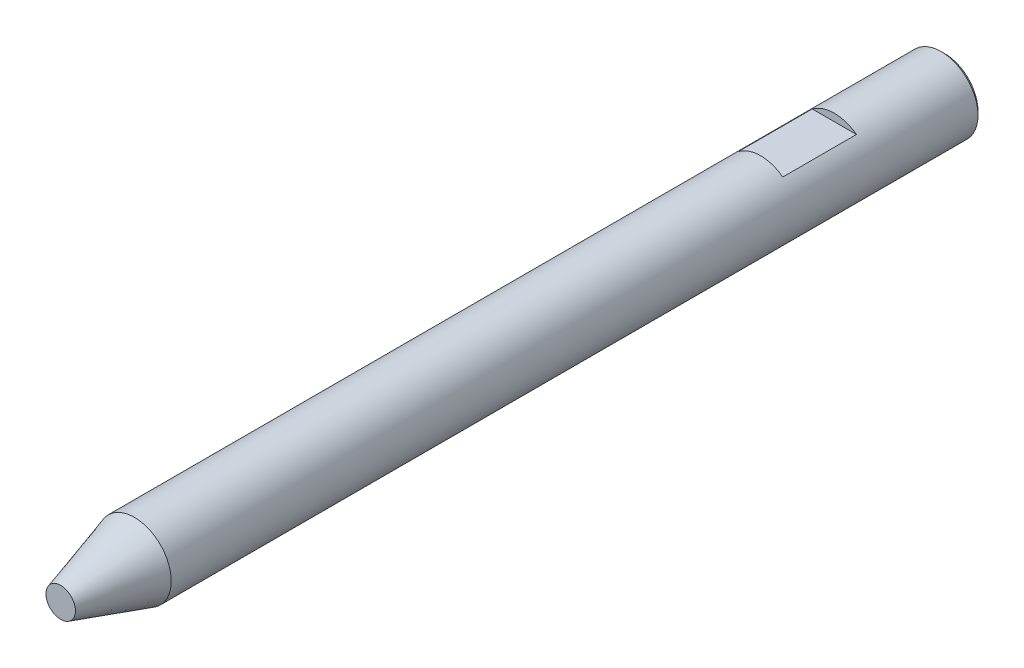
ISO-10303-21;
HEADER;
FILE_DESCRIPTION(('STEP AP214'),'2;1');
FILE_NAME('part.step','',(''),(''),'','','');
FILE_SCHEMA(('AUTOMOTIVE_DESIGN { 1 0 10303 214 1 1 1 1 }'));
ENDSEC;
DATA;
#1=APPLICATION_CONTEXT('core data for automotive mechanical design processes');
#2=APPLICATION_PROTOCOL_DEFINITION('international standard','automotive_design',2000,#1);
#3=PRODUCT_CONTEXT('',#1,'mechanical');
#4=PRODUCT('Part','Part','',(#3));
#5=PRODUCT_RELATED_PRODUCT_CATEGORY('part','',(#4));
#6=PRODUCT_DEFINITION_FORMATION('','',#4);
#7=PRODUCT_DEFINITION_CONTEXT('part definition',#1,'design');
#8=PRODUCT_DEFINITION('design','',#6,#7);
#9=PRODUCT_DEFINITION_SHAPE('','',#8);
#10=(LENGTH_UNIT() NAMED_UNIT(*) SI_UNIT(.MILLI.,.METRE.));
#11=(NAMED_UNIT(*) PLANE_ANGLE_UNIT() SI_UNIT($,.RADIAN.));
#12=(NAMED_UNIT(*) SI_UNIT($,.STERADIAN.) SOLID_ANGLE_UNIT());
#13=UNCERTAINTY_MEASURE_WITH_UNIT(LENGTH_MEASURE(1.E-05),#10,'distance_accuracy_value','');
#14=(GEOMETRIC_REPRESENTATION_CONTEXT(3) GLOBAL_UNCERTAINTY_ASSIGNED_CONTEXT((#13)) GLOBAL_UNIT_ASSIGNED_CONTEXT((#10,
#11,#12)) REPRESENTATION_CONTEXT('',''));
#15=CARTESIAN_POINT('',(0.,0.,0.));
#16=DIRECTION('',(0.,0.,1.));
#17=DIRECTION('',(1.,0.,0.));
#18=AXIS2_PLACEMENT_3D('',#15,#16,#17);
#19=CARTESIAN_POINT('',(0.,0.,120.));
#20=DIRECTION('',(0.,0.,-1.));
#21=DIRECTION('',(-1.,0.,0.));
#22=AXIS2_PLACEMENT_3D('',#19,#20,#21);
#23=CYLINDRICAL_SURFACE('',#22,5.);
#24=CARTESIAN_POINT('',(0.,0.,0.499999999999987));
#25=DIRECTION('',(0.,0.,1.));
#26=DIRECTION('',(1.,0.,0.));
#27=AXIS2_PLACEMENT_3D('',#24,#25,#26);
#28=CIRCLE('',#27,5.);
#29=CARTESIAN_POINT('',(5.,0.,0.499999999999987));
#30=VERTEX_POINT('',#29);
#31=EDGE_CURVE('E25',#30,#30,#28,.T.);
#32=ORIENTED_EDGE('',*,*,#31,.T.);
#33=EDGE_LOOP('',(#32));
#34=FACE_BOUND('',#33,.T.);
#35=CARTESIAN_POINT('',(0.,0.,25.));
#36=DIRECTION('',(0.,0.,-1.));
#37=DIRECTION('',(-1.,0.,0.));
#38=AXIS2_PLACEMENT_3D('',#35,#36,#37);
#39=CIRCLE('',#38,5.);
#40=CARTESIAN_POINT('',(-3.,4.,25.));
#41=VERTEX_POINT('',#40);
#42=CARTESIAN_POINT('',(3.,4.,25.));
#43=VERTEX_POINT('',#42);
#44=EDGE_CURVE('E65',#41,#43,#39,.T.);
#45=ORIENTED_EDGE('',*,*,#44,.F.);
#46=DIRECTION('',(0.,0.,-1.));
#47=VECTOR('',#46,1.);
#48=CARTESIAN_POINT('',(-3.,4.,120.));
#49=LINE('',#48,#47);
#50=CARTESIAN_POINT('',(-3.,4.,15.));
#51=VERTEX_POINT('',#50);
#52=EDGE_CURVE('E140',#41,#51,#49,.T.);
#53=ORIENTED_EDGE('',*,*,#52,.T.);
#54=CARTESIAN_POINT('',(0.,0.,15.));
#55=DIRECTION('',(0.,0.,-1.));
#56=DIRECTION('',(-1.,0.,0.));
#57=AXIS2_PLACEMENT_3D('',#54,#55,#56);
#58=CIRCLE('',#57,5.);
#59=CARTESIAN_POINT('',(3.,4.,15.));
#60=VERTEX_POINT('',#59);
#61=EDGE_CURVE('E128',#51,#60,#58,.T.);
#62=ORIENTED_EDGE('',*,*,#61,.T.);
#63=DIRECTION('',(0.,0.,-1.));
#64=VECTOR('',#63,1.);
#65=CARTESIAN_POINT('',(3.,4.,120.));
#66=LINE('',#65,#64);
#67=EDGE_CURVE('E137',#60,#43,#66,.F.);
#68=ORIENTED_EDGE('',*,*,#67,.T.);
#69=EDGE_LOOP('',(#45,#53,#62,#68));
#70=FACE_BOUND('',#69,.T.);
#71=CARTESIAN_POINT('',(0.,0.,110.));
#72=DIRECTION('',(0.,0.,1.));
#73=DIRECTION('',(1.,0.,0.));
#74=AXIS2_PLACEMENT_3D('',#71,#72,#73);
#75=CIRCLE('',#74,5.);
#76=CARTESIAN_POINT('',(5.,0.,110.));
#77=VERTEX_POINT('',#76);
#78=EDGE_CURVE('E122',#77,#77,#75,.F.);
#79=ORIENTED_EDGE('',*,*,#78,.T.);
#80=EDGE_LOOP('',(#79));
#81=FACE_BOUND('',#80,.T.);
#82=CARTESIAN_POINT('',(0.,0.,25.));
#83=DIRECTION('',(0.,0.,-1.));
#84=DIRECTION('',(-1.,0.,0.));
#85=AXIS2_PLACEMENT_3D('',#82,#83,#84);
#86=CIRCLE('',#85,5.);
#87=CARTESIAN_POINT('',(3.,-4.,25.));
#88=VERTEX_POINT('',#87);
#89=CARTESIAN_POINT('',(-3.,-4.,25.));
#90=VERTEX_POINT('',#89);
#91=EDGE_CURVE('E75',#88,#90,#86,.T.);
#92=ORIENTED_EDGE('',*,*,#91,.F.);
#93=DIRECTION('',(0.,0.,-1.));
#94=VECTOR('',#93,1.);
#95=CARTESIAN_POINT('',(3.,-4.,120.));
#96=LINE('',#95,#94);
#97=CARTESIAN_POINT('',(3.,-4.,15.));
#98=VERTEX_POINT('',#97);
#99=EDGE_CURVE('E70',#88,#98,#96,.T.);
#100=ORIENTED_EDGE('',*,*,#99,.T.);
#101=CARTESIAN_POINT('',(0.,0.,15.));
#102=DIRECTION('',(0.,0.,-1.));
#103=DIRECTION('',(-1.,0.,0.));
#104=AXIS2_PLACEMENT_3D('',#101,#102,#103);
#105=CIRCLE('',#104,5.);
#106=CARTESIAN_POINT('',(-3.,-4.,15.));
#107=VERTEX_POINT('',#106);
#108=EDGE_CURVE('E59',#98,#107,#105,.T.);
#109=ORIENTED_EDGE('',*,*,#108,.T.);
#110=DIRECTION('',(0.,0.,-1.));
#111=VECTOR('',#110,1.);
#112=CARTESIAN_POINT('',(-3.,-4.,120.));
#113=LINE('',#112,#111);
#114=EDGE_CURVE('E64',#107,#90,#113,.F.);
#115=ORIENTED_EDGE('',*,*,#114,.T.);
#116=EDGE_LOOP('',(#92,#100,#109,#115));
#117=FACE_BOUND('',#116,.T.);
#118=ADVANCED_FACE('F17',(#34,#70,#81,#117),#23,.T.);
#119=CARTESIAN_POINT('',(0.,0.,120.));
#120=DIRECTION('',(0.,0.,1.));
#121=DIRECTION('',(1.,0.,0.));
#122=AXIS2_PLACEMENT_3D('',#119,#120,#121);
#123=PLANE('',#122);
#124=CARTESIAN_POINT('',(0.,0.,120.));
#125=DIRECTION('',(0.,0.,1.));
#126=DIRECTION('',(1.,0.,0.));
#127=AXIS2_PLACEMENT_3D('',#124,#125,#126);
#128=CIRCLE('',#127,2.00000000000003);
#129=CARTESIAN_POINT('',(2.00000000000003,0.,120.));
#130=VERTEX_POINT('',#129);
#131=EDGE_CURVE('E125',#130,#130,#128,.T.);
#132=ORIENTED_EDGE('',*,*,#131,.T.);
#133=EDGE_LOOP('',(#132));
#134=FACE_BOUND('',#133,.T.);
#135=ADVANCED_FACE('F95',(#134),#123,.T.);
#136=CARTESIAN_POINT('',(0.,0.,0.));
#137=DIRECTION('',(0.,0.,1.));
#138=DIRECTION('',(1.,0.,0.));
#139=AXIS2_PLACEMENT_3D('',#136,#137,#138);
#140=PLANE('',#139);
#141=CARTESIAN_POINT('',(0.,0.,0.));
#142=DIRECTION('',(0.,0.,1.));
#143=DIRECTION('',(1.,0.,0.));
#144=AXIS2_PLACEMENT_3D('',#141,#142,#143);
#145=CIRCLE('',#144,4.5);
#146=CARTESIAN_POINT('',(4.5,0.,0.));
#147=VERTEX_POINT('',#146);
#148=EDGE_CURVE('E11',#147,#147,#145,.F.);
#149=ORIENTED_EDGE('',*,*,#148,.T.);
#150=EDGE_LOOP('',(#149));
#151=FACE_BOUND('',#150,.T.);
#152=CARTESIAN_POINT('',(0.,0.,0.));
#153=DIRECTION('',(0.,0.,-1.));
#154=DIRECTION('',(-1.,0.,0.));
#155=AXIS2_PLACEMENT_3D('',#152,#153,#154);
#156=CIRCLE('',#155,3.);
#157=CARTESIAN_POINT('',(-3.,0.,0.));
#158=VERTEX_POINT('',#157);
#159=EDGE_CURVE('E151',#158,#158,#156,.T.);
#160=ORIENTED_EDGE('',*,*,#159,.F.);
#161=EDGE_LOOP('',(#160));
#162=FACE_BOUND('',#161,.T.);
#163=ADVANCED_FACE('F101',(#151,#162),#140,.F.);
#164=CARTESIAN_POINT('',(0.,0.,120.));
#165=DIRECTION('',(0.,0.,-1.));
#166=DIRECTION('',(-1.,0.,0.));
#167=AXIS2_PLACEMENT_3D('',#164,#165,#166);
#168=CONICAL_SURFACE('',#167,2.00000000000003,0.291456794477864);
#169=ORIENTED_EDGE('',*,*,#78,.F.);
#170=EDGE_LOOP('',(#169));
#171=FACE_BOUND('',#170,.T.);
#172=ORIENTED_EDGE('',*,*,#131,.F.);
#173=EDGE_LOOP('',(#172));
#174=FACE_BOUND('',#173,.T.);
#175=ADVANCED_FACE('F105',(#171,#174),#168,.T.);
#176=CARTESIAN_POINT('',(0.,0.,23.));
#177=DIRECTION('',(0.,0.,-1.));
#178=DIRECTION('',(-1.,0.,0.));
#179=AXIS2_PLACEMENT_3D('',#176,#177,#178);
#180=CONICAL_SURFACE('',#179,2.5,1.02974425867665);
#181=CARTESIAN_POINT('',(0.,0.,24.5021515475689));
#182=VERTEX_POINT('',#181);
#183=VERTEX_LOOP('',#182);
#184=FACE_BOUND('',#183,.T.);
#185=CARTESIAN_POINT('',(0.,0.,23.));
#186=DIRECTION('',(0.,0.,-1.));
#187=DIRECTION('',(-1.,0.,0.));
#188=AXIS2_PLACEMENT_3D('',#185,#186,#187);
#189=CIRCLE('',#188,2.5);
#190=CARTESIAN_POINT('',(-2.5,0.,23.));
#191=VERTEX_POINT('',#190);
#192=EDGE_CURVE('E126',#191,#191,#189,.T.);
#193=ORIENTED_EDGE('',*,*,#192,.T.);
#194=EDGE_LOOP('',(#193));
#195=FACE_BOUND('',#194,.T.);
#196=ADVANCED_FACE('F107',(#184,#195),#180,.F.);
#197=CARTESIAN_POINT('',(0.,0.,0.));
#198=DIRECTION('',(0.,0.,-1.));
#199=DIRECTION('',(-1.,0.,0.));
#200=AXIS2_PLACEMENT_3D('',#197,#198,#199);
#201=CYLINDRICAL_SURFACE('',#200,2.5);
#202=ORIENTED_EDGE('',*,*,#192,.F.);
#203=EDGE_LOOP('',(#202));
#204=FACE_BOUND('',#203,.T.);
#205=CARTESIAN_POINT('',(0.,0.,12.));
#206=DIRECTION('',(0.,0.,-1.));
#207=DIRECTION('',(-1.,0.,0.));
#208=AXIS2_PLACEMENT_3D('',#205,#206,#207);
#209=CIRCLE('',#208,2.5);
#210=CARTESIAN_POINT('',(-2.5,0.,12.));
#211=VERTEX_POINT('',#210);
#212=EDGE_CURVE('E131',#211,#211,#209,.T.);
#213=ORIENTED_EDGE('',*,*,#212,.T.);
#214=EDGE_LOOP('',(#213));
#215=FACE_BOUND('',#214,.T.);
#216=ADVANCED_FACE('F115',(#204,#215),#201,.F.);
#217=CARTESIAN_POINT('',(2.5,0.,12.));
#218=DIRECTION('',(0.,0.,1.));
#219=DIRECTION('',(1.,0.,0.));
#220=AXIS2_PLACEMENT_3D('',#217,#218,#219);
#221=PLANE('',#220);
#222=ORIENTED_EDGE('',*,*,#212,.F.);
#223=EDGE_LOOP('',(#222));
#224=FACE_BOUND('',#223,.T.);
#225=CARTESIAN_POINT('',(0.,0.,12.));
#226=DIRECTION('',(0.,0.,-1.));
#227=DIRECTION('',(-1.,0.,0.));
#228=AXIS2_PLACEMENT_3D('',#225,#226,#227);
#229=CIRCLE('',#228,3.);
#230=CARTESIAN_POINT('',(-3.,0.,12.));
#231=VERTEX_POINT('',#230);
#232=EDGE_CURVE('E160',#231,#231,#229,.T.);
#233=ORIENTED_EDGE('',*,*,#232,.T.);
#234=EDGE_LOOP('',(#233));
#235=FACE_BOUND('',#234,.T.);
#236=ADVANCED_FACE('F166',(#224,#235),#221,.F.);
#237=CARTESIAN_POINT('',(0.,0.,0.));
#238=DIRECTION('',(0.,0.,-1.));
#239=DIRECTION('',(-1.,0.,0.));
#240=AXIS2_PLACEMENT_3D('',#237,#238,#239);
#241=CYLINDRICAL_SURFACE('',#240,3.);
#242=ORIENTED_EDGE('',*,*,#232,.F.);
#243=EDGE_LOOP('',(#242));
#244=FACE_BOUND('',#243,.T.);
#245=ORIENTED_EDGE('',*,*,#159,.T.);
#246=EDGE_LOOP('',(#245));
#247=FACE_BOUND('',#246,.T.);
#248=ADVANCED_FACE('F169',(#244,#247),#241,.F.);
#249=CARTESIAN_POINT('',(6.06585031807481,4.,25.));
#250=DIRECTION('',(0.,-1.,0.));
#251=DIRECTION('',(0.,0.,-1.));
#252=AXIS2_PLACEMENT_3D('',#249,#250,#251);
#253=PLANE('',#252);
#254=DIRECTION('',(-1.,0.,0.));
#255=VECTOR('',#254,1.);
#256=CARTESIAN_POINT('',(6.06585031807481,4.,25.));
#257=LINE('',#256,#255);
#258=EDGE_CURVE('E148',#43,#41,#257,.T.);
#259=ORIENTED_EDGE('',*,*,#258,.F.);
#260=ORIENTED_EDGE('',*,*,#67,.F.);
#261=DIRECTION('',(-1.,0.,0.));
#262=VECTOR('',#261,1.);
#263=CARTESIAN_POINT('',(6.06585031807481,4.,15.));
#264=LINE('',#263,#262);
#265=EDGE_CURVE('E38',#60,#51,#264,.T.);
#266=ORIENTED_EDGE('',*,*,#265,.T.);
#267=ORIENTED_EDGE('',*,*,#52,.F.);
#268=EDGE_LOOP('',(#259,#260,#266,#267));
#269=FACE_BOUND('',#268,.T.);
#270=ADVANCED_FACE('F150',(#269),#253,.F.);
#271=CARTESIAN_POINT('',(0.,0.,25.));
#272=DIRECTION('',(0.,0.,-1.));
#273=DIRECTION('',(-1.,0.,0.));
#274=AXIS2_PLACEMENT_3D('',#271,#272,#273);
#275=PLANE('',#274);
#276=ORIENTED_EDGE('',*,*,#44,.T.);
#277=ORIENTED_EDGE('',*,*,#258,.T.);
#278=EDGE_LOOP('',(#276,#277));
#279=FACE_BOUND('',#278,.T.);
#280=ADVANCED_FACE('F147',(#279),#275,.T.);
#281=CARTESIAN_POINT('',(0.,0.,15.));
#282=DIRECTION('',(0.,0.,-1.));
#283=DIRECTION('',(-1.,0.,0.));
#284=AXIS2_PLACEMENT_3D('',#281,#282,#283);
#285=PLANE('',#284);
#286=ORIENTED_EDGE('',*,*,#265,.F.);
#287=ORIENTED_EDGE('',*,*,#61,.F.);
#288=EDGE_LOOP('',(#286,#287));
#289=FACE_BOUND('',#288,.T.);
#290=ADVANCED_FACE('F154',(#289),#285,.F.);
#291=CARTESIAN_POINT('',(7.56430265318118,-4.,25.));
#292=DIRECTION('',(0.,1.,0.));
#293=DIRECTION('',(0.,0.,1.));
#294=AXIS2_PLACEMENT_3D('',#291,#292,#293);
#295=PLANE('',#294);
#296=DIRECTION('',(1.,0.,0.));
#297=VECTOR('',#296,1.);
#298=CARTESIAN_POINT('',(7.56430265318118,-4.,25.));
#299=LINE('',#298,#297);
#300=EDGE_CURVE('E72',#90,#88,#299,.T.);
#301=ORIENTED_EDGE('',*,*,#300,.F.);
#302=ORIENTED_EDGE('',*,*,#114,.F.);
#303=DIRECTION('',(1.,0.,0.));
#304=VECTOR('',#303,1.);
#305=CARTESIAN_POINT('',(7.56430265318118,-4.,15.));
#306=LINE('',#305,#304);
#307=EDGE_CURVE('E31',#107,#98,#306,.T.);
#308=ORIENTED_EDGE('',*,*,#307,.T.);
#309=ORIENTED_EDGE('',*,*,#99,.F.);
#310=EDGE_LOOP('',(#301,#302,#308,#309));
#311=FACE_BOUND('',#310,.T.);
#312=ADVANCED_FACE('F69',(#311),#295,.F.);
#313=CARTESIAN_POINT('',(0.,0.,25.));
#314=DIRECTION('',(0.,0.,-1.));
#315=DIRECTION('',(-1.,0.,0.));
#316=AXIS2_PLACEMENT_3D('',#313,#314,#315);
#317=PLANE('',#316);
#318=ORIENTED_EDGE('',*,*,#91,.T.);
#319=ORIENTED_EDGE('',*,*,#300,.T.);
#320=EDGE_LOOP('',(#318,#319));
#321=FACE_BOUND('',#320,.T.);
#322=ADVANCED_FACE('F91',(#321),#317,.T.);
#323=CARTESIAN_POINT('',(0.,0.,15.));
#324=DIRECTION('',(0.,0.,-1.));
#325=DIRECTION('',(-1.,0.,0.));
#326=AXIS2_PLACEMENT_3D('',#323,#324,#325);
#327=PLANE('',#326);
#328=ORIENTED_EDGE('',*,*,#307,.F.);
#329=ORIENTED_EDGE('',*,*,#108,.F.);
#330=EDGE_LOOP('',(#328,#329));
#331=FACE_BOUND('',#330,.T.);
#332=ADVANCED_FACE('F60',(#331),#327,.F.);
#333=CARTESIAN_POINT('',(0.,0.,0.499999999999987));
#334=DIRECTION('',(0.,0.,1.));
#335=DIRECTION('',(1.,0.,0.));
#336=AXIS2_PLACEMENT_3D('',#333,#334,#335);
#337=CONICAL_SURFACE('',#336,5.,0.785398163397457);
#338=ORIENTED_EDGE('',*,*,#148,.F.);
#339=EDGE_LOOP('',(#338));
#340=FACE_BOUND('',#339,.T.);
#341=ORIENTED_EDGE('',*,*,#31,.F.);
#342=EDGE_LOOP('',(#341));
#343=FACE_BOUND('',#342,.T.);
#344=ADVANCED_FACE('F19',(#340,#343),#337,.T.);
#345=CLOSED_SHELL('',(#118,#135,#163,#175,#196,#216,#236,#248,#270,#280,#290,#312,#322,#332,#344));
#346=MANIFOLD_SOLID_BREP('B1',#345);
#347=ADVANCED_BREP_SHAPE_REPRESENTATION('',(#18,#346),#14);
#348=SHAPE_DEFINITION_REPRESENTATION(#9,#347);
ENDSEC;
END-ISO-10303-21;
